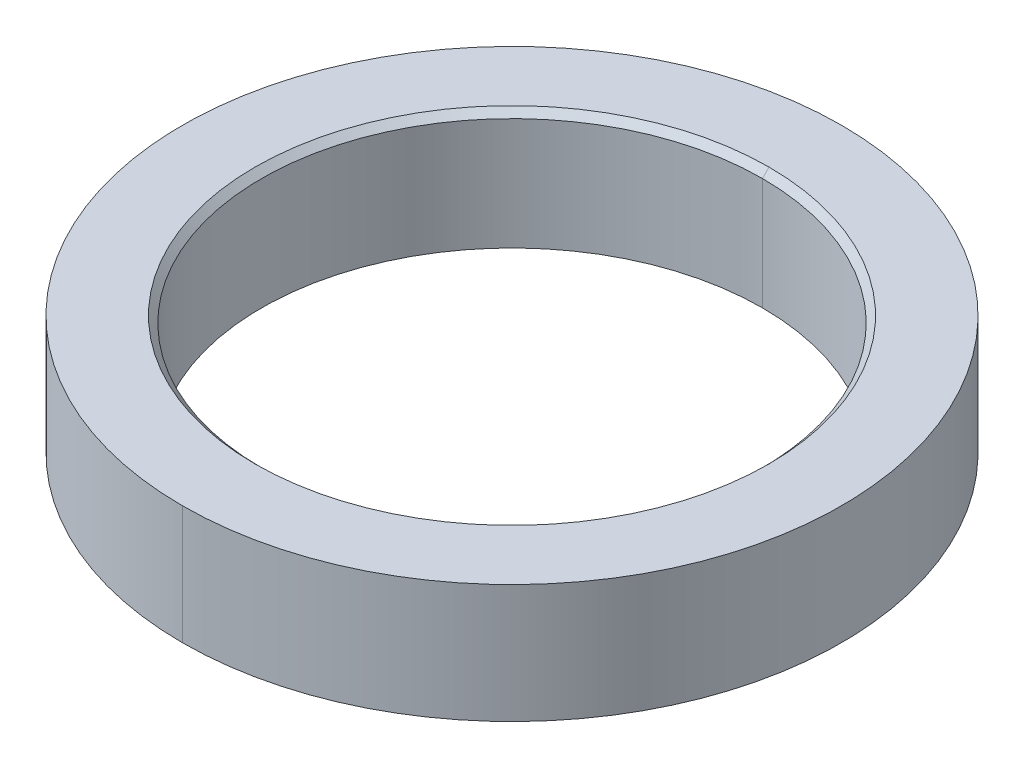
ISO-10303-21;
HEADER;
FILE_DESCRIPTION(('STEP AP214'),'2;1');
FILE_NAME('part.step','',(''),(''),'','','');
FILE_SCHEMA(('AUTOMOTIVE_DESIGN { 1 0 10303 214 1 1 1 1 }'));
ENDSEC;
DATA;
#1=APPLICATION_CONTEXT('core data for automotive mechanical design processes');
#2=APPLICATION_PROTOCOL_DEFINITION('international standard','automotive_design',2000,#1);
#3=PRODUCT_CONTEXT('',#1,'mechanical');
#4=PRODUCT('Part','Part','',(#3));
#5=PRODUCT_RELATED_PRODUCT_CATEGORY('part','',(#4));
#6=PRODUCT_DEFINITION_FORMATION('','',#4);
#7=PRODUCT_DEFINITION_CONTEXT('part definition',#1,'design');
#8=PRODUCT_DEFINITION('design','',#6,#7);
#9=PRODUCT_DEFINITION_SHAPE('','',#8);
#10=(LENGTH_UNIT() NAMED_UNIT(*) SI_UNIT(.MILLI.,.METRE.));
#11=(NAMED_UNIT(*) PLANE_ANGLE_UNIT() SI_UNIT($,.RADIAN.));
#12=(NAMED_UNIT(*) SI_UNIT($,.STERADIAN.) SOLID_ANGLE_UNIT());
#13=UNCERTAINTY_MEASURE_WITH_UNIT(LENGTH_MEASURE(1.E-05),#10,'distance_accuracy_value','');
#14=(GEOMETRIC_REPRESENTATION_CONTEXT(3) GLOBAL_UNCERTAINTY_ASSIGNED_CONTEXT((#13)) GLOBAL_UNIT_ASSIGNED_CONTEXT((#10,
#11,#12)) REPRESENTATION_CONTEXT('',''));
#15=CARTESIAN_POINT('',(0.,0.,0.));
#16=DIRECTION('',(0.,0.,1.));
#17=DIRECTION('',(1.,0.,0.));
#18=AXIS2_PLACEMENT_3D('',#15,#16,#17);
#19=CARTESIAN_POINT('',(0.,1.016,0.));
#20=DIRECTION('',(0.,1.,0.));
#21=DIRECTION('',(0.,0.,1.));
#22=AXIS2_PLACEMENT_3D('',#19,#20,#21);
#23=CONICAL_SURFACE('',#22,4.826,0.785398163397459);
#24=DIRECTION('',(0.,0.70710678118654,-0.707106781186555));
#25=VECTOR('',#24,1.);
#26=CARTESIAN_POINT('',(0.,1.016,-4.826));
#27=LINE('',#26,#25);
#28=CARTESIAN_POINT('',(0.,1.016,-4.826));
#29=VERTEX_POINT('',#28);
#30=CARTESIAN_POINT('',(0.,1.143,-4.953));
#31=VERTEX_POINT('',#30);
#32=EDGE_CURVE('E118',#29,#31,#27,.T.);
#33=ORIENTED_EDGE('',*,*,#32,.F.);
#34=CARTESIAN_POINT('',(0.,1.016,0.));
#35=DIRECTION('',(0.,1.,0.));
#36=DIRECTION('',(0.,0.,1.));
#37=AXIS2_PLACEMENT_3D('',#34,#35,#36);
#38=CIRCLE('',#37,4.826);
#39=CARTESIAN_POINT('',(0.,1.016,4.826));
#40=VERTEX_POINT('',#39);
#41=EDGE_CURVE('E11',#40,#29,#38,.T.);
#42=ORIENTED_EDGE('',*,*,#41,.F.);
#43=DIRECTION('',(0.,0.70710678118654,0.707106781186555));
#44=VECTOR('',#43,1.);
#45=CARTESIAN_POINT('',(0.,1.016,4.826));
#46=LINE('',#45,#44);
#47=CARTESIAN_POINT('',(0.,1.143,4.953));
#48=VERTEX_POINT('',#47);
#49=EDGE_CURVE('E107',#40,#48,#46,.T.);
#50=ORIENTED_EDGE('',*,*,#49,.T.);
#51=CARTESIAN_POINT('',(0.,1.143,0.));
#52=DIRECTION('',(0.,-1.,0.));
#53=DIRECTION('',(0.,0.,1.));
#54=AXIS2_PLACEMENT_3D('',#51,#52,#53);
#55=CIRCLE('',#54,4.953);
#56=EDGE_CURVE('E120',#31,#48,#55,.T.);
#57=ORIENTED_EDGE('',*,*,#56,.F.);
#58=EDGE_LOOP('',(#33,#42,#50,#57));
#59=FACE_BOUND('',#58,.T.);
#60=ADVANCED_FACE('F16',(#59),#23,.F.);
#61=CARTESIAN_POINT('',(0.,1.143,0.));
#62=DIRECTION('',(0.,-1.,0.));
#63=DIRECTION('',(0.,0.,-1.));
#64=AXIS2_PLACEMENT_3D('',#61,#62,#63);
#65=CYLINDRICAL_SURFACE('',#64,4.826);
#66=DIRECTION('',(0.,-1.,0.));
#67=VECTOR('',#66,1.);
#68=CARTESIAN_POINT('',(0.,1.143,4.826));
#69=LINE('',#68,#67);
#70=CARTESIAN_POINT('',(0.,-1.143,4.826));
#71=VERTEX_POINT('',#70);
#72=EDGE_CURVE('E91',#40,#71,#69,.T.);
#73=ORIENTED_EDGE('',*,*,#72,.F.);
#74=ORIENTED_EDGE('',*,*,#41,.T.);
#75=DIRECTION('',(0.,-1.,0.));
#76=VECTOR('',#75,1.);
#77=CARTESIAN_POINT('',(0.,1.143,-4.826));
#78=LINE('',#77,#76);
#79=CARTESIAN_POINT('',(0.,-1.143,-4.826));
#80=VERTEX_POINT('',#79);
#81=EDGE_CURVE('E93',#29,#80,#78,.T.);
#82=ORIENTED_EDGE('',*,*,#81,.T.);
#83=CARTESIAN_POINT('',(0.,-1.143,0.));
#84=DIRECTION('',(0.,1.,0.));
#85=DIRECTION('',(0.,0.,1.));
#86=AXIS2_PLACEMENT_3D('',#83,#84,#85);
#87=CIRCLE('',#86,4.826);
#88=EDGE_CURVE('E20',#71,#80,#87,.T.);
#89=ORIENTED_EDGE('',*,*,#88,.F.);
#90=EDGE_LOOP('',(#73,#74,#82,#89));
#91=FACE_BOUND('',#90,.T.);
#92=ADVANCED_FACE('F89',(#91),#65,.F.);
#93=CARTESIAN_POINT('',(0.,1.143,0.));
#94=DIRECTION('',(0.,-1.,0.));
#95=DIRECTION('',(0.,0.,-1.));
#96=AXIS2_PLACEMENT_3D('',#93,#94,#95);
#97=CYLINDRICAL_SURFACE('',#96,6.35);
#98=DIRECTION('',(0.,-1.,0.));
#99=VECTOR('',#98,1.);
#100=CARTESIAN_POINT('',(0.,1.143,6.35));
#101=LINE('',#100,#99);
#102=CARTESIAN_POINT('',(0.,1.143,6.35));
#103=VERTEX_POINT('',#102);
#104=CARTESIAN_POINT('',(0.,-1.143,6.35));
#105=VERTEX_POINT('',#104);
#106=EDGE_CURVE('E128',#103,#105,#101,.T.);
#107=ORIENTED_EDGE('',*,*,#106,.F.);
#108=CARTESIAN_POINT('',(0.,1.143,0.));
#109=DIRECTION('',(0.,1.,0.));
#110=DIRECTION('',(0.,0.,1.));
#111=AXIS2_PLACEMENT_3D('',#108,#109,#110);
#112=CIRCLE('',#111,6.35);
#113=CARTESIAN_POINT('',(0.,1.143,-6.35));
#114=VERTEX_POINT('',#113);
#115=EDGE_CURVE('E122',#114,#103,#112,.T.);
#116=ORIENTED_EDGE('',*,*,#115,.F.);
#117=DIRECTION('',(0.,-1.,0.));
#118=VECTOR('',#117,1.);
#119=CARTESIAN_POINT('',(0.,1.143,-6.35));
#120=LINE('',#119,#118);
#121=CARTESIAN_POINT('',(0.,-1.143,-6.35));
#122=VERTEX_POINT('',#121);
#123=EDGE_CURVE('E140',#114,#122,#120,.T.);
#124=ORIENTED_EDGE('',*,*,#123,.T.);
#125=CARTESIAN_POINT('',(0.,-1.143,0.));
#126=DIRECTION('',(0.,1.,0.));
#127=DIRECTION('',(0.,0.,1.));
#128=AXIS2_PLACEMENT_3D('',#125,#126,#127);
#129=CIRCLE('',#128,6.35);
#130=EDGE_CURVE('E38',#122,#105,#129,.T.);
#131=ORIENTED_EDGE('',*,*,#130,.T.);
#132=EDGE_LOOP('',(#107,#116,#124,#131));
#133=FACE_BOUND('',#132,.T.);
#134=ADVANCED_FACE('F151',(#133),#97,.T.);
#135=CARTESIAN_POINT('',(0.,-1.143,0.));
#136=DIRECTION('',(0.,1.,0.));
#137=DIRECTION('',(1.,0.,0.));
#138=AXIS2_PLACEMENT_3D('',#135,#136,#137);
#139=PLANE('',#138);
#140=CARTESIAN_POINT('',(0.,-1.143,0.));
#141=DIRECTION('',(0.,1.,0.));
#142=DIRECTION('',(0.,0.,1.));
#143=AXIS2_PLACEMENT_3D('',#140,#141,#142);
#144=CIRCLE('',#143,4.826);
#145=EDGE_CURVE('E97',#80,#71,#144,.T.);
#146=ORIENTED_EDGE('',*,*,#145,.T.);
#147=ORIENTED_EDGE('',*,*,#88,.T.);
#148=EDGE_LOOP('',(#146,#147));
#149=FACE_BOUND('',#148,.T.);
#150=ORIENTED_EDGE('',*,*,#130,.F.);
#151=CARTESIAN_POINT('',(0.,-1.143,0.));
#152=DIRECTION('',(0.,1.,0.));
#153=DIRECTION('',(0.,0.,1.));
#154=AXIS2_PLACEMENT_3D('',#151,#152,#153);
#155=CIRCLE('',#154,6.35);
#156=EDGE_CURVE('E132',#105,#122,#155,.T.);
#157=ORIENTED_EDGE('',*,*,#156,.F.);
#158=EDGE_LOOP('',(#150,#157));
#159=FACE_BOUND('',#158,.T.);
#160=ADVANCED_FACE('F98',(#149,#159),#139,.F.);
#161=CARTESIAN_POINT('',(0.,1.143,0.));
#162=DIRECTION('',(0.,1.,0.));
#163=DIRECTION('',(1.,0.,0.));
#164=AXIS2_PLACEMENT_3D('',#161,#162,#163);
#165=PLANE('',#164);
#166=CARTESIAN_POINT('',(0.,1.143,0.));
#167=DIRECTION('',(0.,-1.,0.));
#168=DIRECTION('',(0.,0.,1.));
#169=AXIS2_PLACEMENT_3D('',#166,#167,#168);
#170=CIRCLE('',#169,4.953);
#171=EDGE_CURVE('E114',#48,#31,#170,.T.);
#172=ORIENTED_EDGE('',*,*,#171,.T.);
#173=ORIENTED_EDGE('',*,*,#56,.T.);
#174=EDGE_LOOP('',(#172,#173));
#175=FACE_BOUND('',#174,.T.);
#176=ORIENTED_EDGE('',*,*,#115,.T.);
#177=CARTESIAN_POINT('',(0.,1.143,0.));
#178=DIRECTION('',(0.,1.,0.));
#179=DIRECTION('',(0.,0.,1.));
#180=AXIS2_PLACEMENT_3D('',#177,#178,#179);
#181=CIRCLE('',#180,6.35);
#182=EDGE_CURVE('E133',#103,#114,#181,.T.);
#183=ORIENTED_EDGE('',*,*,#182,.T.);
#184=EDGE_LOOP('',(#176,#183));
#185=FACE_BOUND('',#184,.T.);
#186=ADVANCED_FACE('F18',(#175,#185),#165,.T.);
#187=CARTESIAN_POINT('',(0.,1.143,0.));
#188=DIRECTION('',(0.,-1.,0.));
#189=DIRECTION('',(0.,0.,-1.));
#190=AXIS2_PLACEMENT_3D('',#187,#188,#189);
#191=CYLINDRICAL_SURFACE('',#190,6.35);
#192=ORIENTED_EDGE('',*,*,#182,.F.);
#193=ORIENTED_EDGE('',*,*,#106,.T.);
#194=ORIENTED_EDGE('',*,*,#156,.T.);
#195=ORIENTED_EDGE('',*,*,#123,.F.);
#196=EDGE_LOOP('',(#192,#193,#194,#195));
#197=FACE_BOUND('',#196,.T.);
#198=ADVANCED_FACE('F153',(#197),#191,.T.);
#199=CARTESIAN_POINT('',(0.,1.143,0.));
#200=DIRECTION('',(0.,-1.,0.));
#201=DIRECTION('',(0.,0.,-1.));
#202=AXIS2_PLACEMENT_3D('',#199,#200,#201);
#203=CYLINDRICAL_SURFACE('',#202,4.826);
#204=CARTESIAN_POINT('',(0.,1.016,0.));
#205=DIRECTION('',(0.,1.,0.));
#206=DIRECTION('',(0.,0.,1.));
#207=AXIS2_PLACEMENT_3D('',#204,#205,#206);
#208=CIRCLE('',#207,4.826);
#209=EDGE_CURVE('E105',#29,#40,#208,.T.);
#210=ORIENTED_EDGE('',*,*,#209,.T.);
#211=ORIENTED_EDGE('',*,*,#72,.T.);
#212=ORIENTED_EDGE('',*,*,#145,.F.);
#213=ORIENTED_EDGE('',*,*,#81,.F.);
#214=EDGE_LOOP('',(#210,#211,#212,#213));
#215=FACE_BOUND('',#214,.T.);
#216=ADVANCED_FACE('F103',(#215),#203,.F.);
#217=CARTESIAN_POINT('',(0.,1.016,0.));
#218=DIRECTION('',(0.,1.,0.));
#219=DIRECTION('',(0.,0.,1.));
#220=AXIS2_PLACEMENT_3D('',#217,#218,#219);
#221=CONICAL_SURFACE('',#220,4.826,0.785398163397459);
#222=ORIENTED_EDGE('',*,*,#209,.F.);
#223=ORIENTED_EDGE('',*,*,#32,.T.);
#224=ORIENTED_EDGE('',*,*,#171,.F.);
#225=ORIENTED_EDGE('',*,*,#49,.F.);
#226=EDGE_LOOP('',(#222,#223,#224,#225));
#227=FACE_BOUND('',#226,.T.);
#228=ADVANCED_FACE('F173',(#227),#221,.F.);
#229=CLOSED_SHELL('',(#60,#92,#134,#160,#186,#198,#216,#228));
#230=MANIFOLD_SOLID_BREP('B1',#229);
#231=ADVANCED_BREP_SHAPE_REPRESENTATION('',(#18,#230),#14);
#232=SHAPE_DEFINITION_REPRESENTATION(#9,#231);
ENDSEC;
END-ISO-10303-21;
